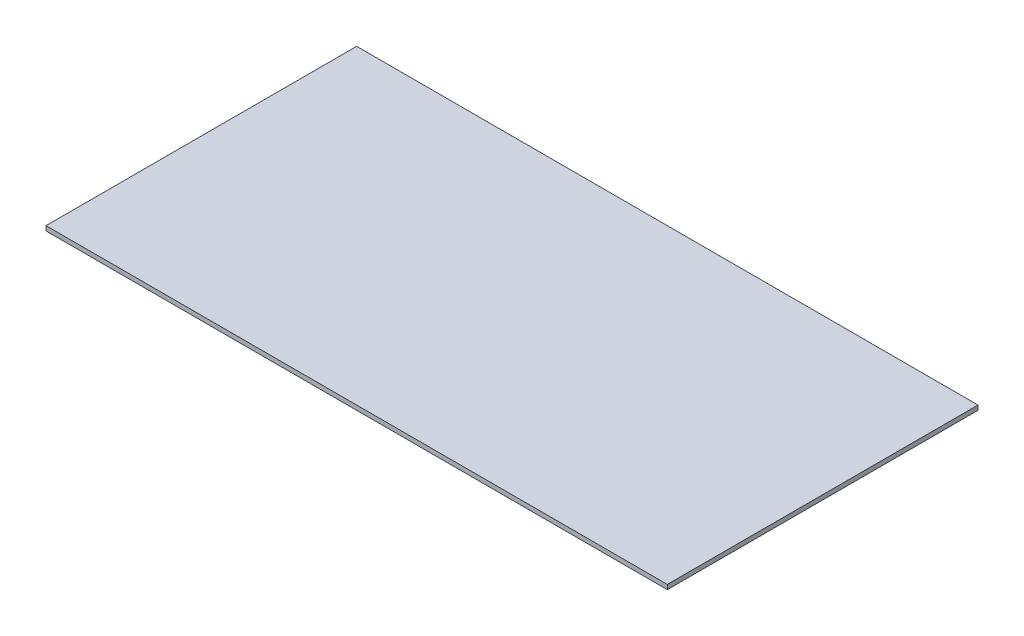
ISO-10303-21;
HEADER;
FILE_DESCRIPTION(('STEP AP214'),'2;1');
FILE_NAME('part.step','',(''),(''),'','','');
FILE_SCHEMA(('AUTOMOTIVE_DESIGN { 1 0 10303 214 1 1 1 1 }'));
ENDSEC;
DATA;
#1=APPLICATION_CONTEXT('core data for automotive mechanical design processes');
#2=APPLICATION_PROTOCOL_DEFINITION('international standard','automotive_design',2000,#1);
#3=PRODUCT_CONTEXT('',#1,'mechanical');
#4=PRODUCT('Part','Part','',(#3));
#5=PRODUCT_RELATED_PRODUCT_CATEGORY('part','',(#4));
#6=PRODUCT_DEFINITION_FORMATION('','',#4);
#7=PRODUCT_DEFINITION_CONTEXT('part definition',#1,'design');
#8=PRODUCT_DEFINITION('design','',#6,#7);
#9=PRODUCT_DEFINITION_SHAPE('','',#8);
#10=(LENGTH_UNIT() NAMED_UNIT(*) SI_UNIT(.MILLI.,.METRE.));
#11=(NAMED_UNIT(*) PLANE_ANGLE_UNIT() SI_UNIT($,.RADIAN.));
#12=(NAMED_UNIT(*) SI_UNIT($,.STERADIAN.) SOLID_ANGLE_UNIT());
#13=UNCERTAINTY_MEASURE_WITH_UNIT(LENGTH_MEASURE(1.E-05),#10,'distance_accuracy_value','');
#14=(GEOMETRIC_REPRESENTATION_CONTEXT(3) GLOBAL_UNCERTAINTY_ASSIGNED_CONTEXT((#13)) GLOBAL_UNIT_ASSIGNED_CONTEXT((#10,
#11,#12)) REPRESENTATION_CONTEXT('',''));
#15=CARTESIAN_POINT('',(0.,0.,0.));
#16=DIRECTION('',(0.,0.,1.));
#17=DIRECTION('',(1.,0.,0.));
#18=AXIS2_PLACEMENT_3D('',#15,#16,#17);
#19=CARTESIAN_POINT('',(-50.9,0.75,-25.45));
#20=DIRECTION('',(1.,0.,0.));
#21=DIRECTION('',(0.,0.,-1.));
#22=AXIS2_PLACEMENT_3D('',#19,#20,#21);
#23=PLANE('',#22);
#24=DIRECTION('',(0.,0.,1.));
#25=VECTOR('',#24,1.);
#26=CARTESIAN_POINT('',(-50.9,0.,-25.45));
#27=LINE('',#26,#25);
#28=CARTESIAN_POINT('',(-50.9,0.,-25.45));
#29=VERTEX_POINT('',#28);
#30=CARTESIAN_POINT('',(-50.9,0.,25.45));
#31=VERTEX_POINT('',#30);
#32=EDGE_CURVE('E107',#29,#31,#27,.T.);
#33=ORIENTED_EDGE('',*,*,#32,.T.);
#34=DIRECTION('',(0.,-1.,0.));
#35=VECTOR('',#34,1.);
#36=CARTESIAN_POINT('',(-50.9,0.75,25.45));
#37=LINE('',#36,#35);
#38=CARTESIAN_POINT('',(-50.9,0.75,25.45));
#39=VERTEX_POINT('',#38);
#40=EDGE_CURVE('E11',#39,#31,#37,.T.);
#41=ORIENTED_EDGE('',*,*,#40,.F.);
#42=DIRECTION('',(0.,0.,1.));
#43=VECTOR('',#42,1.);
#44=CARTESIAN_POINT('',(-50.9,0.75,-25.45));
#45=LINE('',#44,#43);
#46=CARTESIAN_POINT('',(-50.9,0.75,-25.45));
#47=VERTEX_POINT('',#46);
#48=EDGE_CURVE('E91',#47,#39,#45,.T.);
#49=ORIENTED_EDGE('',*,*,#48,.F.);
#50=DIRECTION('',(0.,-1.,0.));
#51=VECTOR('',#50,1.);
#52=CARTESIAN_POINT('',(-50.9,0.75,-25.45));
#53=LINE('',#52,#51);
#54=EDGE_CURVE('E103',#47,#29,#53,.T.);
#55=ORIENTED_EDGE('',*,*,#54,.T.);
#56=EDGE_LOOP('',(#33,#41,#49,#55));
#57=FACE_BOUND('',#56,.T.);
#58=ADVANCED_FACE('F39',(#57),#23,.F.);
#59=CARTESIAN_POINT('',(-50.9,0.75,25.45));
#60=DIRECTION('',(0.,0.,-1.));
#61=DIRECTION('',(-1.,0.,0.));
#62=AXIS2_PLACEMENT_3D('',#59,#60,#61);
#63=PLANE('',#62);
#64=DIRECTION('',(1.,0.,0.));
#65=VECTOR('',#64,1.);
#66=CARTESIAN_POINT('',(-50.9,0.,25.45));
#67=LINE('',#66,#65);
#68=CARTESIAN_POINT('',(50.9,0.,25.45));
#69=VERTEX_POINT('',#68);
#70=EDGE_CURVE('E96',#31,#69,#67,.T.);
#71=ORIENTED_EDGE('',*,*,#70,.T.);
#72=DIRECTION('',(0.,-1.,0.));
#73=VECTOR('',#72,1.);
#74=CARTESIAN_POINT('',(50.9,0.75,25.45));
#75=LINE('',#74,#73);
#76=CARTESIAN_POINT('',(50.9,0.75,25.45));
#77=VERTEX_POINT('',#76);
#78=EDGE_CURVE('E48',#77,#69,#75,.T.);
#79=ORIENTED_EDGE('',*,*,#78,.F.);
#80=DIRECTION('',(1.,0.,0.));
#81=VECTOR('',#80,1.);
#82=CARTESIAN_POINT('',(-50.9,0.75,25.45));
#83=LINE('',#82,#81);
#84=EDGE_CURVE('E86',#39,#77,#83,.T.);
#85=ORIENTED_EDGE('',*,*,#84,.F.);
#86=ORIENTED_EDGE('',*,*,#40,.T.);
#87=EDGE_LOOP('',(#71,#79,#85,#86));
#88=FACE_BOUND('',#87,.T.);
#89=ADVANCED_FACE('F95',(#88),#63,.F.);
#90=CARTESIAN_POINT('',(50.9,0.75,-25.45));
#91=DIRECTION('',(-1.,0.,0.));
#92=DIRECTION('',(0.,0.,1.));
#93=AXIS2_PLACEMENT_3D('',#90,#91,#92);
#94=PLANE('',#93);
#95=DIRECTION('',(0.,0.,-1.));
#96=VECTOR('',#95,1.);
#97=CARTESIAN_POINT('',(50.9,0.,-25.45));
#98=LINE('',#97,#96);
#99=CARTESIAN_POINT('',(50.9,0.,-25.45));
#100=VERTEX_POINT('',#99);
#101=EDGE_CURVE('E73',#69,#100,#98,.T.);
#102=ORIENTED_EDGE('',*,*,#101,.T.);
#103=DIRECTION('',(0.,-1.,0.));
#104=VECTOR('',#103,1.);
#105=CARTESIAN_POINT('',(50.9,0.75,-25.45));
#106=LINE('',#105,#104);
#107=CARTESIAN_POINT('',(50.9,0.75,-25.45));
#108=VERTEX_POINT('',#107);
#109=EDGE_CURVE('E98',#108,#100,#106,.T.);
#110=ORIENTED_EDGE('',*,*,#109,.F.);
#111=DIRECTION('',(0.,0.,-1.));
#112=VECTOR('',#111,1.);
#113=CARTESIAN_POINT('',(50.9,0.75,-25.45));
#114=LINE('',#113,#112);
#115=EDGE_CURVE('E89',#77,#108,#114,.T.);
#116=ORIENTED_EDGE('',*,*,#115,.F.);
#117=ORIENTED_EDGE('',*,*,#78,.T.);
#118=EDGE_LOOP('',(#102,#110,#116,#117));
#119=FACE_BOUND('',#118,.T.);
#120=ADVANCED_FACE('F99',(#119),#94,.F.);
#121=CARTESIAN_POINT('',(-50.9,0.75,-25.45));
#122=DIRECTION('',(0.,0.,1.));
#123=DIRECTION('',(1.,0.,0.));
#124=AXIS2_PLACEMENT_3D('',#121,#122,#123);
#125=PLANE('',#124);
#126=DIRECTION('',(-1.,0.,0.));
#127=VECTOR('',#126,1.);
#128=CARTESIAN_POINT('',(-50.9,0.,-25.45));
#129=LINE('',#128,#127);
#130=EDGE_CURVE('E79',#100,#29,#129,.T.);
#131=ORIENTED_EDGE('',*,*,#130,.T.);
#132=ORIENTED_EDGE('',*,*,#54,.F.);
#133=DIRECTION('',(-1.,0.,0.));
#134=VECTOR('',#133,1.);
#135=CARTESIAN_POINT('',(-50.9,0.75,-25.45));
#136=LINE('',#135,#134);
#137=EDGE_CURVE('E56',#108,#47,#136,.T.);
#138=ORIENTED_EDGE('',*,*,#137,.F.);
#139=ORIENTED_EDGE('',*,*,#109,.T.);
#140=EDGE_LOOP('',(#131,#132,#138,#139));
#141=FACE_BOUND('',#140,.T.);
#142=ADVANCED_FACE('F120',(#141),#125,.F.);
#143=CARTESIAN_POINT('',(0.,0.75,0.));
#144=DIRECTION('',(0.,1.,0.));
#145=DIRECTION('',(0.,0.,1.));
#146=AXIS2_PLACEMENT_3D('',#143,#144,#145);
#147=PLANE('',#146);
#148=ORIENTED_EDGE('',*,*,#48,.T.);
#149=ORIENTED_EDGE('',*,*,#84,.T.);
#150=ORIENTED_EDGE('',*,*,#115,.T.);
#151=ORIENTED_EDGE('',*,*,#137,.T.);
#152=EDGE_LOOP('',(#148,#149,#150,#151));
#153=FACE_BOUND('',#152,.T.);
#154=ADVANCED_FACE('F87',(#153),#147,.T.);
#155=CARTESIAN_POINT('',(0.,0.,0.));
#156=DIRECTION('',(0.,1.,0.));
#157=DIRECTION('',(0.,0.,1.));
#158=AXIS2_PLACEMENT_3D('',#155,#156,#157);
#159=PLANE('',#158);
#160=ORIENTED_EDGE('',*,*,#32,.F.);
#161=ORIENTED_EDGE('',*,*,#130,.F.);
#162=ORIENTED_EDGE('',*,*,#101,.F.);
#163=ORIENTED_EDGE('',*,*,#70,.F.);
#164=EDGE_LOOP('',(#160,#161,#162,#163));
#165=FACE_BOUND('',#164,.T.);
#166=ADVANCED_FACE('F123',(#165),#159,.F.);
#167=CLOSED_SHELL('',(#58,#89,#120,#142,#154,#166));
#168=MANIFOLD_SOLID_BREP('B2',#167);
#169=ADVANCED_BREP_SHAPE_REPRESENTATION('',(#18,#168),#14);
#170=SHAPE_DEFINITION_REPRESENTATION(#9,#169);
ENDSEC;
END-ISO-10303-21;
